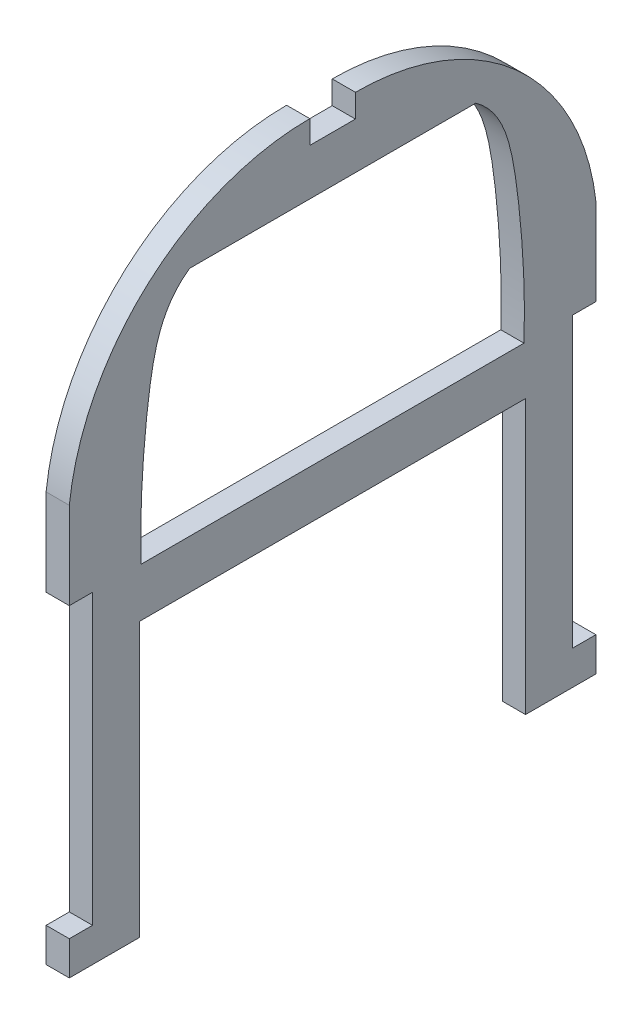
ISO-10303-21;
HEADER;
FILE_DESCRIPTION(('STEP AP214'),'2;1');
FILE_NAME('part.step','',(''),(''),'','','');
FILE_SCHEMA(('AUTOMOTIVE_DESIGN { 1 0 10303 214 1 1 1 1 }'));
ENDSEC;
DATA;
#1=APPLICATION_CONTEXT('core data for automotive mechanical design processes');
#2=APPLICATION_PROTOCOL_DEFINITION('international standard','automotive_design',2000,#1);
#3=PRODUCT_CONTEXT('',#1,'mechanical');
#4=PRODUCT('Part','Part','',(#3));
#5=PRODUCT_RELATED_PRODUCT_CATEGORY('part','',(#4));
#6=PRODUCT_DEFINITION_FORMATION('','',#4);
#7=PRODUCT_DEFINITION_CONTEXT('part definition',#1,'design');
#8=PRODUCT_DEFINITION('design','',#6,#7);
#9=PRODUCT_DEFINITION_SHAPE('','',#8);
#10=(LENGTH_UNIT() NAMED_UNIT(*) SI_UNIT(.MILLI.,.METRE.));
#11=(NAMED_UNIT(*) PLANE_ANGLE_UNIT() SI_UNIT($,.RADIAN.));
#12=(NAMED_UNIT(*) SI_UNIT($,.STERADIAN.) SOLID_ANGLE_UNIT());
#13=UNCERTAINTY_MEASURE_WITH_UNIT(LENGTH_MEASURE(1.E-05),#10,'distance_accuracy_value','');
#14=(GEOMETRIC_REPRESENTATION_CONTEXT(3) GLOBAL_UNCERTAINTY_ASSIGNED_CONTEXT((#13)) GLOBAL_UNIT_ASSIGNED_CONTEXT((#10,
#11,#12)) REPRESENTATION_CONTEXT('',''));
#15=CARTESIAN_POINT('',(0.,0.,0.));
#16=DIRECTION('',(0.,0.,1.));
#17=DIRECTION('',(1.,0.,0.));
#18=AXIS2_PLACEMENT_3D('',#15,#16,#17);
#19=CARTESIAN_POINT('',(3.,30.,18.5));
#20=CARTESIAN_POINT('',(3.,27.6227521418104,21.8999217496941));
#21=CARTESIAN_POINT('',(3.,22.0645423239073,23.3386148930416));
#22=CARTESIAN_POINT('',(3.,11.6888924553406,24.6033177757509));
#23=CARTESIAN_POINT('',(3.,4.97196171850311,24.9290049914649));
#24=CARTESIAN_POINT('',(3.,0.,24.75));
#25=B_SPLINE_CURVE_WITH_KNOTS('',3,(#19,#20,#21,#22,#23,#24),.UNSPECIFIED.,.F.,.F.,(4,1,1,4),
(0.,0.363581561104022,0.525534896752478,1.),.UNSPECIFIED.);
#26=DIRECTION('',(-1.,0.,0.));
#27=VECTOR('',#26,1.);
#28=SURFACE_OF_LINEAR_EXTRUSION('',#25,#27);
#29=CARTESIAN_POINT('',(0.,30.,18.5));
#30=CARTESIAN_POINT('',(0.,27.6227521418104,21.8999217496941));
#31=CARTESIAN_POINT('',(0.,22.0645423239073,23.3386148930416));
#32=CARTESIAN_POINT('',(0.,11.6888924553406,24.6033177757509));
#33=CARTESIAN_POINT('',(0.,4.97196171850311,24.9290049914649));
#34=CARTESIAN_POINT('',(0.,0.,24.75));
#35=B_SPLINE_CURVE_WITH_KNOTS('',3,(#29,#30,#31,#32,#33,#34),.UNSPECIFIED.,.F.,.F.,(4,1,1,4),
(0.,0.363581561104022,0.525534896752478,1.),.UNSPECIFIED.);
#36=CARTESIAN_POINT('',(0.,30.,18.5));
#37=VERTEX_POINT('',#36);
#38=CARTESIAN_POINT('',(0.,0.,24.75));
#39=VERTEX_POINT('',#38);
#40=EDGE_CURVE('E297',#37,#39,#35,.T.);
#41=ORIENTED_EDGE('',*,*,#40,.F.);
#42=DIRECTION('',(-1.,0.,0.));
#43=VECTOR('',#42,1.);
#44=CARTESIAN_POINT('',(3.,30.,18.5));
#45=LINE('',#44,#43);
#46=CARTESIAN_POINT('',(3.,30.,18.5));
#47=VERTEX_POINT('',#46);
#48=EDGE_CURVE('E11',#47,#37,#45,.T.);
#49=ORIENTED_EDGE('',*,*,#48,.F.);
#50=CARTESIAN_POINT('',(3.,0.,24.75));
#51=VERTEX_POINT('',#50);
#52=EDGE_CURVE('E224',#47,#51,#25,.T.);
#53=ORIENTED_EDGE('',*,*,#52,.T.);
#54=DIRECTION('',(-1.,0.,0.));
#55=VECTOR('',#54,1.);
#56=CARTESIAN_POINT('',(3.,0.,24.75));
#57=LINE('',#56,#55);
#58=EDGE_CURVE('E62',#51,#39,#57,.T.);
#59=ORIENTED_EDGE('',*,*,#58,.T.);
#60=EDGE_LOOP('',(#41,#49,#53,#59));
#61=FACE_BOUND('',#60,.T.);
#62=ADVANCED_FACE('F43',(#61),#28,.T.);
#63=CARTESIAN_POINT('',(3.,30.,0.));
#64=DIRECTION('',(0.,1.,0.));
#65=DIRECTION('',(0.,0.,1.));
#66=AXIS2_PLACEMENT_3D('',#63,#64,#65);
#67=PLANE('',#66);
#68=DIRECTION('',(0.,0.,-1.));
#69=VECTOR('',#68,1.);
#70=CARTESIAN_POINT('',(0.,30.,0.));
#71=LINE('',#70,#69);
#72=CARTESIAN_POINT('',(0.,30.,-18.5));
#73=VERTEX_POINT('',#72);
#74=EDGE_CURVE('E229',#37,#73,#71,.T.);
#75=ORIENTED_EDGE('',*,*,#74,.T.);
#76=DIRECTION('',(-1.,0.,0.));
#77=VECTOR('',#76,1.);
#78=CARTESIAN_POINT('',(3.,30.,-18.5));
#79=LINE('',#78,#77);
#80=CARTESIAN_POINT('',(3.,30.,-18.5));
#81=VERTEX_POINT('',#80);
#82=EDGE_CURVE('E53',#81,#73,#79,.T.);
#83=ORIENTED_EDGE('',*,*,#82,.F.);
#84=DIRECTION('',(0.,0.,-1.));
#85=VECTOR('',#84,1.);
#86=CARTESIAN_POINT('',(3.,30.,0.));
#87=LINE('',#86,#85);
#88=EDGE_CURVE('E219',#47,#81,#87,.T.);
#89=ORIENTED_EDGE('',*,*,#88,.F.);
#90=ORIENTED_EDGE('',*,*,#48,.T.);
#91=EDGE_LOOP('',(#75,#83,#89,#90));
#92=FACE_BOUND('',#91,.T.);
#93=ADVANCED_FACE('F227',(#92),#67,.F.);
#94=CARTESIAN_POINT('',(3.,30.,-18.5));
#95=CARTESIAN_POINT('',(3.,27.6227521418104,-21.8999217496941));
#96=CARTESIAN_POINT('',(3.,22.0645423239073,-23.3386148930416));
#97=CARTESIAN_POINT('',(3.,11.6888924553406,-24.6033177757509));
#98=CARTESIAN_POINT('',(3.,4.97196171850311,-24.9290049914649));
#99=CARTESIAN_POINT('',(3.,0.,-24.75));
#100=B_SPLINE_CURVE_WITH_KNOTS('',3,(#94,#95,#96,#97,#98,#99),.UNSPECIFIED.,.F.,.F.,(4,1,1,4),
(0.,0.363581561104022,0.525534896752478,1.),.UNSPECIFIED.);
#101=DIRECTION('',(-1.,0.,0.));
#102=VECTOR('',#101,1.);
#103=SURFACE_OF_LINEAR_EXTRUSION('',#100,#102);
#104=CARTESIAN_POINT('',(0.,30.,-18.5));
#105=CARTESIAN_POINT('',(0.,27.6227521418104,-21.8999217496941));
#106=CARTESIAN_POINT('',(0.,22.0645423239073,-23.3386148930416));
#107=CARTESIAN_POINT('',(0.,11.6888924553406,-24.6033177757509));
#108=CARTESIAN_POINT('',(0.,4.97196171850311,-24.9290049914649));
#109=CARTESIAN_POINT('',(0.,0.,-24.75));
#110=B_SPLINE_CURVE_WITH_KNOTS('',3,(#104,#105,#106,#107,#108,#109),.UNSPECIFIED.,.F.,.F.,(4,1,
1,4),(0.,0.363581561104022,0.525534896752478,1.),.UNSPECIFIED.);
#111=CARTESIAN_POINT('',(0.,0.,-24.75));
#112=VERTEX_POINT('',#111);
#113=EDGE_CURVE('E289',#73,#112,#110,.T.);
#114=ORIENTED_EDGE('',*,*,#113,.T.);
#115=DIRECTION('',(-1.,0.,0.));
#116=VECTOR('',#115,1.);
#117=CARTESIAN_POINT('',(3.,0.,-24.75));
#118=LINE('',#117,#116);
#119=CARTESIAN_POINT('',(3.,0.,-24.75));
#120=VERTEX_POINT('',#119);
#121=EDGE_CURVE('E136',#120,#112,#118,.T.);
#122=ORIENTED_EDGE('',*,*,#121,.F.);
#123=EDGE_CURVE('E211',#81,#120,#100,.T.);
#124=ORIENTED_EDGE('',*,*,#123,.F.);
#125=ORIENTED_EDGE('',*,*,#82,.T.);
#126=EDGE_LOOP('',(#114,#122,#124,#125));
#127=FACE_BOUND('',#126,.T.);
#128=ADVANCED_FACE('F213',(#127),#103,.F.);
#129=CARTESIAN_POINT('',(3.,0.,-31.05));
#130=DIRECTION('',(0.,0.,-1.));
#131=DIRECTION('',(0.,1.,0.));
#132=AXIS2_PLACEMENT_3D('',#129,#130,#131);
#133=PLANE('',#132);
#134=DIRECTION('',(0.,-1.,0.));
#135=VECTOR('',#134,1.);
#136=CARTESIAN_POINT('',(0.,0.,-31.05));
#137=LINE('',#136,#135);
#138=CARTESIAN_POINT('',(0.,0.,-31.05));
#139=VERTEX_POINT('',#138);
#140=CARTESIAN_POINT('',(0.,-37.3,-31.05));
#141=VERTEX_POINT('',#140);
#142=EDGE_CURVE('E353',#139,#141,#137,.T.);
#143=ORIENTED_EDGE('',*,*,#142,.F.);
#144=DIRECTION('',(-1.,0.,0.));
#145=VECTOR('',#144,1.);
#146=CARTESIAN_POINT('',(3.,0.,-31.05));
#147=LINE('',#146,#145);
#148=CARTESIAN_POINT('',(3.,0.,-31.05));
#149=VERTEX_POINT('',#148);
#150=EDGE_CURVE('E47',#149,#139,#147,.T.);
#151=ORIENTED_EDGE('',*,*,#150,.F.);
#152=DIRECTION('',(0.,-1.,0.));
#153=VECTOR('',#152,1.);
#154=CARTESIAN_POINT('',(3.,0.,-31.05));
#155=LINE('',#154,#153);
#156=CARTESIAN_POINT('',(3.,-37.3,-31.05));
#157=VERTEX_POINT('',#156);
#158=EDGE_CURVE('E288',#149,#157,#155,.T.);
#159=ORIENTED_EDGE('',*,*,#158,.T.);
#160=DIRECTION('',(-1.,0.,0.));
#161=VECTOR('',#160,1.);
#162=CARTESIAN_POINT('',(3.,-37.3,-31.05));
#163=LINE('',#162,#161);
#164=EDGE_CURVE('E234',#157,#141,#163,.T.);
#165=ORIENTED_EDGE('',*,*,#164,.T.);
#166=EDGE_LOOP('',(#143,#151,#159,#165));
#167=FACE_BOUND('',#166,.T.);
#168=ADVANCED_FACE('F45',(#167),#133,.T.);
#169=CARTESIAN_POINT('',(3.,0.,0.));
#170=DIRECTION('',(0.,1.,0.));
#171=DIRECTION('',(0.,0.,1.));
#172=AXIS2_PLACEMENT_3D('',#169,#170,#171);
#173=PLANE('',#172);
#174=DIRECTION('',(0.,0.,-1.));
#175=VECTOR('',#174,1.);
#176=CARTESIAN_POINT('',(0.,0.,0.));
#177=LINE('',#176,#175);
#178=CARTESIAN_POINT('',(0.,0.,-34.05));
#179=VERTEX_POINT('',#178);
#180=EDGE_CURVE('E351',#139,#179,#177,.T.);
#181=ORIENTED_EDGE('',*,*,#180,.T.);
#182=DIRECTION('',(-1.,0.,0.));
#183=VECTOR('',#182,1.);
#184=CARTESIAN_POINT('',(3.,0.,-34.05));
#185=LINE('',#184,#183);
#186=CARTESIAN_POINT('',(3.,0.,-34.05));
#187=VERTEX_POINT('',#186);
#188=EDGE_CURVE('E275',#187,#179,#185,.T.);
#189=ORIENTED_EDGE('',*,*,#188,.F.);
#190=DIRECTION('',(0.,0.,-1.));
#191=VECTOR('',#190,1.);
#192=CARTESIAN_POINT('',(3.,0.,0.));
#193=LINE('',#192,#191);
#194=EDGE_CURVE('E427',#149,#187,#193,.T.);
#195=ORIENTED_EDGE('',*,*,#194,.F.);
#196=ORIENTED_EDGE('',*,*,#150,.T.);
#197=EDGE_LOOP('',(#181,#189,#195,#196));
#198=FACE_BOUND('',#197,.T.);
#199=ADVANCED_FACE('F440',(#198),#173,.F.);
#200=CARTESIAN_POINT('',(3.,0.,-34.05));
#201=DIRECTION('',(0.,0.,1.));
#202=DIRECTION('',(1.,0.,0.));
#203=AXIS2_PLACEMENT_3D('',#200,#201,#202);
#204=PLANE('',#203);
#205=DIRECTION('',(0.,1.,0.));
#206=VECTOR('',#205,1.);
#207=CARTESIAN_POINT('',(0.,0.,-34.05));
#208=LINE('',#207,#206);
#209=CARTESIAN_POINT('',(0.,11.245142960023,-34.05));
#210=VERTEX_POINT('',#209);
#211=EDGE_CURVE('E349',#179,#210,#208,.T.);
#212=ORIENTED_EDGE('',*,*,#211,.T.);
#213=DIRECTION('',(-1.,0.,0.));
#214=VECTOR('',#213,1.);
#215=CARTESIAN_POINT('',(3.,11.245142960023,-34.05));
#216=LINE('',#215,#214);
#217=CARTESIAN_POINT('',(3.,11.245142960023,-34.05));
#218=VERTEX_POINT('',#217);
#219=EDGE_CURVE('E274',#218,#210,#216,.T.);
#220=ORIENTED_EDGE('',*,*,#219,.F.);
#221=DIRECTION('',(0.,1.,0.));
#222=VECTOR('',#221,1.);
#223=CARTESIAN_POINT('',(3.,0.,-34.05));
#224=LINE('',#223,#222);
#225=EDGE_CURVE('E425',#187,#218,#224,.T.);
#226=ORIENTED_EDGE('',*,*,#225,.F.);
#227=ORIENTED_EDGE('',*,*,#188,.T.);
#228=EDGE_LOOP('',(#212,#220,#226,#227));
#229=FACE_BOUND('',#228,.T.);
#230=ADVANCED_FACE('F442',(#229),#204,.F.);
#231=CARTESIAN_POINT('',(3.,7.69841399638855,-2.95));
#232=DIRECTION('',(-1.,0.,0.));
#233=DIRECTION('',(0.,0.,1.));
#234=AXIS2_PLACEMENT_3D('',#231,#232,#233);
#235=CYLINDRICAL_SURFACE('',#234,31.3015860036114);
#236=CARTESIAN_POINT('',(0.,7.69841399638855,-2.95));
#237=DIRECTION('',(1.,0.,0.));
#238=DIRECTION('',(0.,0.,-1.));
#239=AXIS2_PLACEMENT_3D('',#236,#237,#238);
#240=CIRCLE('',#239,31.3015860036114);
#241=CARTESIAN_POINT('',(0.,39.,-2.95));
#242=VERTEX_POINT('',#241);
#243=EDGE_CURVE('E346',#242,#210,#240,.F.);
#244=ORIENTED_EDGE('',*,*,#243,.F.);
#245=DIRECTION('',(-1.,0.,0.));
#246=VECTOR('',#245,1.);
#247=CARTESIAN_POINT('',(3.,39.,-2.95));
#248=LINE('',#247,#246);
#249=CARTESIAN_POINT('',(3.,39.,-2.95));
#250=VERTEX_POINT('',#249);
#251=EDGE_CURVE('E272',#250,#242,#248,.T.);
#252=ORIENTED_EDGE('',*,*,#251,.F.);
#253=CARTESIAN_POINT('',(3.,7.69841399638855,-2.95));
#254=DIRECTION('',(1.,0.,0.));
#255=DIRECTION('',(0.,0.,-1.));
#256=AXIS2_PLACEMENT_3D('',#253,#254,#255);
#257=CIRCLE('',#256,31.3015860036114);
#258=EDGE_CURVE('E422',#250,#218,#257,.F.);
#259=ORIENTED_EDGE('',*,*,#258,.T.);
#260=ORIENTED_EDGE('',*,*,#219,.T.);
#261=EDGE_LOOP('',(#244,#252,#259,#260));
#262=FACE_BOUND('',#261,.T.);
#263=ADVANCED_FACE('F544',(#262),#235,.T.);
#264=CARTESIAN_POINT('',(3.,0.,-2.95));
#265=DIRECTION('',(0.,0.,1.));
#266=DIRECTION('',(1.,0.,0.));
#267=AXIS2_PLACEMENT_3D('',#264,#265,#266);
#268=PLANE('',#267);
#269=DIRECTION('',(0.,1.,0.));
#270=VECTOR('',#269,1.);
#271=CARTESIAN_POINT('',(0.,0.,-2.95));
#272=LINE('',#271,#270);
#273=CARTESIAN_POINT('',(0.,36.,-2.95));
#274=VERTEX_POINT('',#273);
#275=EDGE_CURVE('E343',#274,#242,#272,.T.);
#276=ORIENTED_EDGE('',*,*,#275,.F.);
#277=DIRECTION('',(-1.,0.,0.));
#278=VECTOR('',#277,1.);
#279=CARTESIAN_POINT('',(3.,36.,-2.95));
#280=LINE('',#279,#278);
#281=CARTESIAN_POINT('',(3.,36.,-2.95));
#282=VERTEX_POINT('',#281);
#283=EDGE_CURVE('E270',#282,#274,#280,.T.);
#284=ORIENTED_EDGE('',*,*,#283,.F.);
#285=DIRECTION('',(0.,1.,0.));
#286=VECTOR('',#285,1.);
#287=CARTESIAN_POINT('',(3.,0.,-2.95));
#288=LINE('',#287,#286);
#289=EDGE_CURVE('E419',#282,#250,#288,.T.);
#290=ORIENTED_EDGE('',*,*,#289,.T.);
#291=ORIENTED_EDGE('',*,*,#251,.T.);
#292=EDGE_LOOP('',(#276,#284,#290,#291));
#293=FACE_BOUND('',#292,.T.);
#294=ADVANCED_FACE('F449',(#293),#268,.T.);
#295=CARTESIAN_POINT('',(3.,36.,0.));
#296=DIRECTION('',(0.,1.,0.));
#297=DIRECTION('',(0.,0.,1.));
#298=AXIS2_PLACEMENT_3D('',#295,#296,#297);
#299=PLANE('',#298);
#300=DIRECTION('',(0.,0.,-1.));
#301=VECTOR('',#300,1.);
#302=CARTESIAN_POINT('',(0.,36.,0.));
#303=LINE('',#302,#301);
#304=CARTESIAN_POINT('',(0.,36.,2.95));
#305=VERTEX_POINT('',#304);
#306=EDGE_CURVE('E340',#305,#274,#303,.T.);
#307=ORIENTED_EDGE('',*,*,#306,.F.);
#308=DIRECTION('',(-1.,0.,0.));
#309=VECTOR('',#308,1.);
#310=CARTESIAN_POINT('',(3.,36.,2.95));
#311=LINE('',#310,#309);
#312=CARTESIAN_POINT('',(3.,36.,2.95));
#313=VERTEX_POINT('',#312);
#314=EDGE_CURVE('E268',#313,#305,#311,.T.);
#315=ORIENTED_EDGE('',*,*,#314,.F.);
#316=DIRECTION('',(0.,0.,-1.));
#317=VECTOR('',#316,1.);
#318=CARTESIAN_POINT('',(3.,36.,0.));
#319=LINE('',#318,#317);
#320=EDGE_CURVE('E416',#313,#282,#319,.T.);
#321=ORIENTED_EDGE('',*,*,#320,.T.);
#322=ORIENTED_EDGE('',*,*,#283,.T.);
#323=EDGE_LOOP('',(#307,#315,#321,#322));
#324=FACE_BOUND('',#323,.T.);
#325=ADVANCED_FACE('F453',(#324),#299,.T.);
#326=CARTESIAN_POINT('',(3.,0.,2.95000000000001));
#327=DIRECTION('',(0.,0.,1.));
#328=DIRECTION('',(0.,-1.,0.));
#329=AXIS2_PLACEMENT_3D('',#326,#327,#328);
#330=PLANE('',#329);
#331=DIRECTION('',(0.,1.,0.));
#332=VECTOR('',#331,1.);
#333=CARTESIAN_POINT('',(0.,0.,2.95000000000001));
#334=LINE('',#333,#332);
#335=CARTESIAN_POINT('',(0.,39.,2.95));
#336=VERTEX_POINT('',#335);
#337=EDGE_CURVE('E338',#305,#336,#334,.T.);
#338=ORIENTED_EDGE('',*,*,#337,.T.);
#339=DIRECTION('',(-1.,0.,0.));
#340=VECTOR('',#339,1.);
#341=CARTESIAN_POINT('',(3.,39.,2.95));
#342=LINE('',#341,#340);
#343=CARTESIAN_POINT('',(3.,39.,2.95));
#344=VERTEX_POINT('',#343);
#345=EDGE_CURVE('E265',#344,#336,#342,.T.);
#346=ORIENTED_EDGE('',*,*,#345,.F.);
#347=DIRECTION('',(0.,1.,0.));
#348=VECTOR('',#347,1.);
#349=CARTESIAN_POINT('',(3.,0.,2.95000000000001));
#350=LINE('',#349,#348);
#351=EDGE_CURVE('E414',#313,#344,#350,.T.);
#352=ORIENTED_EDGE('',*,*,#351,.F.);
#353=ORIENTED_EDGE('',*,*,#314,.T.);
#354=EDGE_LOOP('',(#338,#346,#352,#353));
#355=FACE_BOUND('',#354,.T.);
#356=ADVANCED_FACE('F460',(#355),#330,.F.);
#357=CARTESIAN_POINT('',(3.,7.69841399638855,2.95));
#358=DIRECTION('',(-1.,0.,0.));
#359=DIRECTION('',(0.,0.,1.));
#360=AXIS2_PLACEMENT_3D('',#357,#358,#359);
#361=CYLINDRICAL_SURFACE('',#360,31.3015860036114);
#362=CARTESIAN_POINT('',(0.,7.69841399638855,2.95));
#363=DIRECTION('',(1.,0.,0.));
#364=DIRECTION('',(0.,0.,-1.));
#365=AXIS2_PLACEMENT_3D('',#362,#363,#364);
#366=CIRCLE('',#365,31.3015860036114);
#367=CARTESIAN_POINT('',(0.,11.245142960023,34.05));
#368=VERTEX_POINT('',#367);
#369=EDGE_CURVE('E335',#336,#368,#366,.T.);
#370=ORIENTED_EDGE('',*,*,#369,.T.);
#371=DIRECTION('',(-1.,0.,0.));
#372=VECTOR('',#371,1.);
#373=CARTESIAN_POINT('',(3.,11.245142960023,34.05));
#374=LINE('',#373,#372);
#375=CARTESIAN_POINT('',(3.,11.245142960023,34.05));
#376=VERTEX_POINT('',#375);
#377=EDGE_CURVE('E263',#376,#368,#374,.T.);
#378=ORIENTED_EDGE('',*,*,#377,.F.);
#379=CARTESIAN_POINT('',(3.,7.69841399638855,2.95));
#380=DIRECTION('',(1.,0.,0.));
#381=DIRECTION('',(0.,0.,-1.));
#382=AXIS2_PLACEMENT_3D('',#379,#380,#381);
#383=CIRCLE('',#382,31.3015860036114);
#384=EDGE_CURVE('E412',#344,#376,#383,.T.);
#385=ORIENTED_EDGE('',*,*,#384,.F.);
#386=ORIENTED_EDGE('',*,*,#345,.T.);
#387=EDGE_LOOP('',(#370,#378,#385,#386));
#388=FACE_BOUND('',#387,.T.);
#389=ADVANCED_FACE('F464',(#388),#361,.T.);
#390=CARTESIAN_POINT('',(3.,0.,34.05));
#391=DIRECTION('',(0.,0.,1.));
#392=DIRECTION('',(1.,0.,0.));
#393=AXIS2_PLACEMENT_3D('',#390,#391,#392);
#394=PLANE('',#393);
#395=DIRECTION('',(0.,1.,0.));
#396=VECTOR('',#395,1.);
#397=CARTESIAN_POINT('',(0.,0.,34.05));
#398=LINE('',#397,#396);
#399=CARTESIAN_POINT('',(0.,0.,34.05));
#400=VERTEX_POINT('',#399);
#401=EDGE_CURVE('E332',#400,#368,#398,.T.);
#402=ORIENTED_EDGE('',*,*,#401,.F.);
#403=DIRECTION('',(-1.,0.,0.));
#404=VECTOR('',#403,1.);
#405=CARTESIAN_POINT('',(3.,0.,34.05));
#406=LINE('',#405,#404);
#407=CARTESIAN_POINT('',(3.,0.,34.05));
#408=VERTEX_POINT('',#407);
#409=EDGE_CURVE('E261',#408,#400,#406,.T.);
#410=ORIENTED_EDGE('',*,*,#409,.F.);
#411=DIRECTION('',(0.,1.,0.));
#412=VECTOR('',#411,1.);
#413=CARTESIAN_POINT('',(3.,0.,34.05));
#414=LINE('',#413,#412);
#415=EDGE_CURVE('E409',#408,#376,#414,.T.);
#416=ORIENTED_EDGE('',*,*,#415,.T.);
#417=ORIENTED_EDGE('',*,*,#377,.T.);
#418=EDGE_LOOP('',(#402,#410,#416,#417));
#419=FACE_BOUND('',#418,.T.);
#420=ADVANCED_FACE('F467',(#419),#394,.T.);
#421=CARTESIAN_POINT('',(3.,0.,0.));
#422=DIRECTION('',(0.,1.,0.));
#423=DIRECTION('',(0.,0.,1.));
#424=AXIS2_PLACEMENT_3D('',#421,#422,#423);
#425=PLANE('',#424);
#426=DIRECTION('',(0.,0.,-1.));
#427=VECTOR('',#426,1.);
#428=CARTESIAN_POINT('',(0.,0.,0.));
#429=LINE('',#428,#427);
#430=CARTESIAN_POINT('',(0.,0.,31.05));
#431=VERTEX_POINT('',#430);
#432=EDGE_CURVE('E330',#400,#431,#429,.T.);
#433=ORIENTED_EDGE('',*,*,#432,.T.);
#434=DIRECTION('',(-1.,0.,0.));
#435=VECTOR('',#434,1.);
#436=CARTESIAN_POINT('',(3.,0.,31.05));
#437=LINE('',#436,#435);
#438=CARTESIAN_POINT('',(3.,0.,31.05));
#439=VERTEX_POINT('',#438);
#440=EDGE_CURVE('E258',#439,#431,#437,.T.);
#441=ORIENTED_EDGE('',*,*,#440,.F.);
#442=DIRECTION('',(0.,0.,-1.));
#443=VECTOR('',#442,1.);
#444=CARTESIAN_POINT('',(3.,0.,0.));
#445=LINE('',#444,#443);
#446=EDGE_CURVE('E407',#408,#439,#445,.T.);
#447=ORIENTED_EDGE('',*,*,#446,.F.);
#448=ORIENTED_EDGE('',*,*,#409,.T.);
#449=EDGE_LOOP('',(#433,#441,#447,#448));
#450=FACE_BOUND('',#449,.T.);
#451=ADVANCED_FACE('F473',(#450),#425,.F.);
#452=CARTESIAN_POINT('',(3.,0.,31.05));
#453=DIRECTION('',(0.,0.,-1.));
#454=DIRECTION('',(0.,1.,0.));
#455=AXIS2_PLACEMENT_3D('',#452,#453,#454);
#456=PLANE('',#455);
#457=DIRECTION('',(0.,-1.,0.));
#458=VECTOR('',#457,1.);
#459=CARTESIAN_POINT('',(0.,0.,31.05));
#460=LINE('',#459,#458);
#461=CARTESIAN_POINT('',(0.,-37.3,31.05));
#462=VERTEX_POINT('',#461);
#463=EDGE_CURVE('E328',#431,#462,#460,.T.);
#464=ORIENTED_EDGE('',*,*,#463,.T.);
#465=DIRECTION('',(-1.,0.,0.));
#466=VECTOR('',#465,1.);
#467=CARTESIAN_POINT('',(3.,-37.3,31.05));
#468=LINE('',#467,#466);
#469=CARTESIAN_POINT('',(3.,-37.3,31.05));
#470=VERTEX_POINT('',#469);
#471=EDGE_CURVE('E255',#470,#462,#468,.T.);
#472=ORIENTED_EDGE('',*,*,#471,.F.);
#473=DIRECTION('',(0.,-1.,0.));
#474=VECTOR('',#473,1.);
#475=CARTESIAN_POINT('',(3.,0.,31.05));
#476=LINE('',#475,#474);
#477=EDGE_CURVE('E405',#439,#470,#476,.T.);
#478=ORIENTED_EDGE('',*,*,#477,.F.);
#479=ORIENTED_EDGE('',*,*,#440,.T.);
#480=EDGE_LOOP('',(#464,#472,#478,#479));
#481=FACE_BOUND('',#480,.T.);
#482=ADVANCED_FACE('F477',(#481),#456,.F.);
#483=CARTESIAN_POINT('',(3.,-37.3,0.));
#484=DIRECTION('',(0.,-1.,0.));
#485=DIRECTION('',(0.,0.,-1.));
#486=AXIS2_PLACEMENT_3D('',#483,#484,#485);
#487=PLANE('',#486);
#488=DIRECTION('',(0.,0.,1.));
#489=VECTOR('',#488,1.);
#490=CARTESIAN_POINT('',(0.,-37.3,0.));
#491=LINE('',#490,#489);
#492=CARTESIAN_POINT('',(0.,-37.3,34.05));
#493=VERTEX_POINT('',#492);
#494=EDGE_CURVE('E326',#462,#493,#491,.T.);
#495=ORIENTED_EDGE('',*,*,#494,.T.);
#496=DIRECTION('',(-1.,0.,0.));
#497=VECTOR('',#496,1.);
#498=CARTESIAN_POINT('',(3.,-37.3,34.05));
#499=LINE('',#498,#497);
#500=CARTESIAN_POINT('',(3.,-37.3,34.05));
#501=VERTEX_POINT('',#500);
#502=EDGE_CURVE('E252',#501,#493,#499,.T.);
#503=ORIENTED_EDGE('',*,*,#502,.F.);
#504=DIRECTION('',(0.,0.,1.));
#505=VECTOR('',#504,1.);
#506=CARTESIAN_POINT('',(3.,-37.3,0.));
#507=LINE('',#506,#505);
#508=EDGE_CURVE('E403',#470,#501,#507,.T.);
#509=ORIENTED_EDGE('',*,*,#508,.F.);
#510=ORIENTED_EDGE('',*,*,#471,.T.);
#511=EDGE_LOOP('',(#495,#503,#509,#510));
#512=FACE_BOUND('',#511,.T.);
#513=ADVANCED_FACE('F482',(#512),#487,.F.);
#514=CARTESIAN_POINT('',(3.,0.,34.05));
#515=DIRECTION('',(0.,0.,-1.));
#516=DIRECTION('',(-1.,0.,0.));
#517=AXIS2_PLACEMENT_3D('',#514,#515,#516);
#518=PLANE('',#517);
#519=DIRECTION('',(0.,-1.,0.));
#520=VECTOR('',#519,1.);
#521=CARTESIAN_POINT('',(0.,0.,34.05));
#522=LINE('',#521,#520);
#523=CARTESIAN_POINT('',(0.,-41.7,34.05));
#524=VERTEX_POINT('',#523);
#525=EDGE_CURVE('E324',#493,#524,#522,.T.);
#526=ORIENTED_EDGE('',*,*,#525,.T.);
#527=DIRECTION('',(-1.,0.,0.));
#528=VECTOR('',#527,1.);
#529=CARTESIAN_POINT('',(3.,-41.7,34.05));
#530=LINE('',#529,#528);
#531=CARTESIAN_POINT('',(3.,-41.7,34.05));
#532=VERTEX_POINT('',#531);
#533=EDGE_CURVE('E249',#532,#524,#530,.T.);
#534=ORIENTED_EDGE('',*,*,#533,.F.);
#535=DIRECTION('',(0.,-1.,0.));
#536=VECTOR('',#535,1.);
#537=CARTESIAN_POINT('',(3.,0.,34.05));
#538=LINE('',#537,#536);
#539=EDGE_CURVE('E401',#501,#532,#538,.T.);
#540=ORIENTED_EDGE('',*,*,#539,.F.);
#541=ORIENTED_EDGE('',*,*,#502,.T.);
#542=EDGE_LOOP('',(#526,#534,#540,#541));
#543=FACE_BOUND('',#542,.T.);
#544=ADVANCED_FACE('F488',(#543),#518,.F.);
#545=CARTESIAN_POINT('',(3.,-41.7,0.));
#546=DIRECTION('',(0.,1.,0.));
#547=DIRECTION('',(0.,0.,1.));
#548=AXIS2_PLACEMENT_3D('',#545,#546,#547);
#549=PLANE('',#548);
#550=DIRECTION('',(0.,0.,-1.));
#551=VECTOR('',#550,1.);
#552=CARTESIAN_POINT('',(0.,-41.7,0.));
#553=LINE('',#552,#551);
#554=CARTESIAN_POINT('',(0.,-41.7,24.95));
#555=VERTEX_POINT('',#554);
#556=EDGE_CURVE('E322',#524,#555,#553,.T.);
#557=ORIENTED_EDGE('',*,*,#556,.T.);
#558=DIRECTION('',(-1.,0.,0.));
#559=VECTOR('',#558,1.);
#560=CARTESIAN_POINT('',(3.,-41.7,24.95));
#561=LINE('',#560,#559);
#562=CARTESIAN_POINT('',(3.,-41.7,24.95));
#563=VERTEX_POINT('',#562);
#564=EDGE_CURVE('E246',#563,#555,#561,.T.);
#565=ORIENTED_EDGE('',*,*,#564,.F.);
#566=DIRECTION('',(0.,0.,-1.));
#567=VECTOR('',#566,1.);
#568=CARTESIAN_POINT('',(3.,-41.7,0.));
#569=LINE('',#568,#567);
#570=EDGE_CURVE('E399',#532,#563,#569,.T.);
#571=ORIENTED_EDGE('',*,*,#570,.F.);
#572=ORIENTED_EDGE('',*,*,#533,.T.);
#573=EDGE_LOOP('',(#557,#565,#571,#572));
#574=FACE_BOUND('',#573,.T.);
#575=ADVANCED_FACE('F492',(#574),#549,.F.);
#576=CARTESIAN_POINT('',(3.,0.,24.95));
#577=DIRECTION('',(0.,0.,1.));
#578=DIRECTION('',(0.,-1.,0.));
#579=AXIS2_PLACEMENT_3D('',#576,#577,#578);
#580=PLANE('',#579);
#581=DIRECTION('',(0.,1.,0.));
#582=VECTOR('',#581,1.);
#583=CARTESIAN_POINT('',(0.,0.,24.95));
#584=LINE('',#583,#582);
#585=CARTESIAN_POINT('',(0.,-6.3,24.95));
#586=VERTEX_POINT('',#585);
#587=EDGE_CURVE('E319',#555,#586,#584,.T.);
#588=ORIENTED_EDGE('',*,*,#587,.T.);
#589=DIRECTION('',(-1.,0.,0.));
#590=VECTOR('',#589,1.);
#591=CARTESIAN_POINT('',(3.,-6.3,24.95));
#592=LINE('',#591,#590);
#593=CARTESIAN_POINT('',(3.,-6.3,24.95));
#594=VERTEX_POINT('',#593);
#595=EDGE_CURVE('E244',#594,#586,#592,.T.);
#596=ORIENTED_EDGE('',*,*,#595,.F.);
#597=DIRECTION('',(0.,1.,0.));
#598=VECTOR('',#597,1.);
#599=CARTESIAN_POINT('',(3.,0.,24.95));
#600=LINE('',#599,#598);
#601=EDGE_CURVE('E397',#563,#594,#600,.T.);
#602=ORIENTED_EDGE('',*,*,#601,.F.);
#603=ORIENTED_EDGE('',*,*,#564,.T.);
#604=EDGE_LOOP('',(#588,#596,#602,#603));
#605=FACE_BOUND('',#604,.T.);
#606=ADVANCED_FACE('F497',(#605),#580,.F.);
#607=CARTESIAN_POINT('',(3.,-6.3,0.));
#608=DIRECTION('',(0.,-1.,0.));
#609=DIRECTION('',(0.,0.,-1.));
#610=AXIS2_PLACEMENT_3D('',#607,#608,#609);
#611=PLANE('',#610);
#612=DIRECTION('',(0.,0.,1.));
#613=VECTOR('',#612,1.);
#614=CARTESIAN_POINT('',(0.,-6.3,0.));
#615=LINE('',#614,#613);
#616=CARTESIAN_POINT('',(0.,-6.3,-24.95));
#617=VERTEX_POINT('',#616);
#618=EDGE_CURVE('E316',#617,#586,#615,.T.);
#619=ORIENTED_EDGE('',*,*,#618,.F.);
#620=DIRECTION('',(-1.,0.,0.));
#621=VECTOR('',#620,1.);
#622=CARTESIAN_POINT('',(3.,-6.3,-24.95));
#623=LINE('',#622,#621);
#624=CARTESIAN_POINT('',(3.,-6.3,-24.95));
#625=VERTEX_POINT('',#624);
#626=EDGE_CURVE('E242',#625,#617,#623,.T.);
#627=ORIENTED_EDGE('',*,*,#626,.F.);
#628=DIRECTION('',(0.,0.,1.));
#629=VECTOR('',#628,1.);
#630=CARTESIAN_POINT('',(3.,-6.3,0.));
#631=LINE('',#630,#629);
#632=EDGE_CURVE('E394',#625,#594,#631,.T.);
#633=ORIENTED_EDGE('',*,*,#632,.T.);
#634=ORIENTED_EDGE('',*,*,#595,.T.);
#635=EDGE_LOOP('',(#619,#627,#633,#634));
#636=FACE_BOUND('',#635,.T.);
#637=ADVANCED_FACE('F519',(#636),#611,.T.);
#638=CARTESIAN_POINT('',(3.,0.,-24.95));
#639=DIRECTION('',(0.,0.,1.));
#640=DIRECTION('',(0.,-1.,0.));
#641=AXIS2_PLACEMENT_3D('',#638,#639,#640);
#642=PLANE('',#641);
#643=DIRECTION('',(0.,1.,0.));
#644=VECTOR('',#643,1.);
#645=CARTESIAN_POINT('',(0.,0.,-24.95));
#646=LINE('',#645,#644);
#647=CARTESIAN_POINT('',(0.,-41.7,-24.95));
#648=VERTEX_POINT('',#647);
#649=EDGE_CURVE('E313',#648,#617,#646,.T.);
#650=ORIENTED_EDGE('',*,*,#649,.F.);
#651=DIRECTION('',(-1.,0.,0.));
#652=VECTOR('',#651,1.);
#653=CARTESIAN_POINT('',(3.,-41.7,-24.95));
#654=LINE('',#653,#652);
#655=CARTESIAN_POINT('',(3.,-41.7,-24.95));
#656=VERTEX_POINT('',#655);
#657=EDGE_CURVE('E240',#656,#648,#654,.T.);
#658=ORIENTED_EDGE('',*,*,#657,.F.);
#659=DIRECTION('',(0.,1.,0.));
#660=VECTOR('',#659,1.);
#661=CARTESIAN_POINT('',(3.,0.,-24.95));
#662=LINE('',#661,#660);
#663=EDGE_CURVE('E391',#656,#625,#662,.T.);
#664=ORIENTED_EDGE('',*,*,#663,.T.);
#665=ORIENTED_EDGE('',*,*,#626,.T.);
#666=EDGE_LOOP('',(#650,#658,#664,#665));
#667=FACE_BOUND('',#666,.T.);
#668=ADVANCED_FACE('F503',(#667),#642,.T.);
#669=CARTESIAN_POINT('',(3.,-41.7,0.));
#670=DIRECTION('',(0.,-1.,0.));
#671=DIRECTION('',(0.,0.,-1.));
#672=AXIS2_PLACEMENT_3D('',#669,#670,#671);
#673=PLANE('',#672);
#674=DIRECTION('',(0.,0.,1.));
#675=VECTOR('',#674,1.);
#676=CARTESIAN_POINT('',(0.,-41.7,0.));
#677=LINE('',#676,#675);
#678=CARTESIAN_POINT('',(0.,-41.7,-34.05));
#679=VERTEX_POINT('',#678);
#680=EDGE_CURVE('E310',#679,#648,#677,.T.);
#681=ORIENTED_EDGE('',*,*,#680,.F.);
#682=DIRECTION('',(-1.,0.,0.));
#683=VECTOR('',#682,1.);
#684=CARTESIAN_POINT('',(3.,-41.7,-34.05));
#685=LINE('',#684,#683);
#686=CARTESIAN_POINT('',(3.,-41.7,-34.05));
#687=VERTEX_POINT('',#686);
#688=EDGE_CURVE('E238',#687,#679,#685,.T.);
#689=ORIENTED_EDGE('',*,*,#688,.F.);
#690=DIRECTION('',(0.,0.,1.));
#691=VECTOR('',#690,1.);
#692=CARTESIAN_POINT('',(3.,-41.7,0.));
#693=LINE('',#692,#691);
#694=EDGE_CURVE('E388',#687,#656,#693,.T.);
#695=ORIENTED_EDGE('',*,*,#694,.T.);
#696=ORIENTED_EDGE('',*,*,#657,.T.);
#697=EDGE_LOOP('',(#681,#689,#695,#696));
#698=FACE_BOUND('',#697,.T.);
#699=ADVANCED_FACE('F507',(#698),#673,.T.);
#700=CARTESIAN_POINT('',(3.,0.,-34.05));
#701=DIRECTION('',(0.,0.,-1.));
#702=DIRECTION('',(-1.,0.,0.));
#703=AXIS2_PLACEMENT_3D('',#700,#701,#702);
#704=PLANE('',#703);
#705=DIRECTION('',(0.,-1.,0.));
#706=VECTOR('',#705,1.);
#707=CARTESIAN_POINT('',(0.,0.,-34.05));
#708=LINE('',#707,#706);
#709=CARTESIAN_POINT('',(0.,-37.3,-34.05));
#710=VERTEX_POINT('',#709);
#711=EDGE_CURVE('E307',#710,#679,#708,.T.);
#712=ORIENTED_EDGE('',*,*,#711,.F.);
#713=DIRECTION('',(-1.,0.,0.));
#714=VECTOR('',#713,1.);
#715=CARTESIAN_POINT('',(3.,-37.3,-34.05));
#716=LINE('',#715,#714);
#717=CARTESIAN_POINT('',(3.,-37.3,-34.05));
#718=VERTEX_POINT('',#717);
#719=EDGE_CURVE('E236',#718,#710,#716,.T.);
#720=ORIENTED_EDGE('',*,*,#719,.F.);
#721=DIRECTION('',(0.,-1.,0.));
#722=VECTOR('',#721,1.);
#723=CARTESIAN_POINT('',(3.,0.,-34.05));
#724=LINE('',#723,#722);
#725=EDGE_CURVE('E385',#718,#687,#724,.T.);
#726=ORIENTED_EDGE('',*,*,#725,.T.);
#727=ORIENTED_EDGE('',*,*,#688,.T.);
#728=EDGE_LOOP('',(#712,#720,#726,#727));
#729=FACE_BOUND('',#728,.T.);
#730=ADVANCED_FACE('F509',(#729),#704,.T.);
#731=CARTESIAN_POINT('',(3.,-37.3,0.));
#732=DIRECTION('',(0.,1.,0.));
#733=DIRECTION('',(0.,0.,1.));
#734=AXIS2_PLACEMENT_3D('',#731,#732,#733);
#735=PLANE('',#734);
#736=DIRECTION('',(0.,0.,-1.));
#737=VECTOR('',#736,1.);
#738=CARTESIAN_POINT('',(0.,-37.3,0.));
#739=LINE('',#738,#737);
#740=EDGE_CURVE('E301',#141,#710,#739,.T.);
#741=ORIENTED_EDGE('',*,*,#740,.F.);
#742=ORIENTED_EDGE('',*,*,#164,.F.);
#743=DIRECTION('',(0.,0.,-1.));
#744=VECTOR('',#743,1.);
#745=CARTESIAN_POINT('',(3.,-37.3,0.));
#746=LINE('',#745,#744);
#747=EDGE_CURVE('E379',#157,#718,#746,.T.);
#748=ORIENTED_EDGE('',*,*,#747,.T.);
#749=ORIENTED_EDGE('',*,*,#719,.T.);
#750=EDGE_LOOP('',(#741,#742,#748,#749));
#751=FACE_BOUND('',#750,.T.);
#752=ADVANCED_FACE('F373',(#751),#735,.T.);
#753=CARTESIAN_POINT('',(3.,0.,0.));
#754=DIRECTION('',(0.,1.,0.));
#755=DIRECTION('',(0.,0.,1.));
#756=AXIS2_PLACEMENT_3D('',#753,#754,#755);
#757=PLANE('',#756);
#758=DIRECTION('',(0.,0.,-1.));
#759=VECTOR('',#758,1.);
#760=CARTESIAN_POINT('',(0.,0.,0.));
#761=LINE('',#760,#759);
#762=EDGE_CURVE('E285',#39,#112,#761,.T.);
#763=ORIENTED_EDGE('',*,*,#762,.F.);
#764=ORIENTED_EDGE('',*,*,#58,.F.);
#765=DIRECTION('',(0.,0.,-1.));
#766=VECTOR('',#765,1.);
#767=CARTESIAN_POINT('',(3.,0.,0.));
#768=LINE('',#767,#766);
#769=EDGE_CURVE('E218',#51,#120,#768,.T.);
#770=ORIENTED_EDGE('',*,*,#769,.T.);
#771=ORIENTED_EDGE('',*,*,#121,.T.);
#772=EDGE_LOOP('',(#763,#764,#770,#771));
#773=FACE_BOUND('',#772,.T.);
#774=ADVANCED_FACE('F367',(#773),#757,.T.);
#775=CARTESIAN_POINT('',(3.,0.,0.));
#776=DIRECTION('',(1.,0.,0.));
#777=DIRECTION('',(0.,0.,-1.));
#778=AXIS2_PLACEMENT_3D('',#775,#776,#777);
#779=PLANE('',#778);
#780=ORIENTED_EDGE('',*,*,#158,.F.);
#781=ORIENTED_EDGE('',*,*,#194,.T.);
#782=ORIENTED_EDGE('',*,*,#225,.T.);
#783=ORIENTED_EDGE('',*,*,#258,.F.);
#784=ORIENTED_EDGE('',*,*,#289,.F.);
#785=ORIENTED_EDGE('',*,*,#320,.F.);
#786=ORIENTED_EDGE('',*,*,#351,.T.);
#787=ORIENTED_EDGE('',*,*,#384,.T.);
#788=ORIENTED_EDGE('',*,*,#415,.F.);
#789=ORIENTED_EDGE('',*,*,#446,.T.);
#790=ORIENTED_EDGE('',*,*,#477,.T.);
#791=ORIENTED_EDGE('',*,*,#508,.T.);
#792=ORIENTED_EDGE('',*,*,#539,.T.);
#793=ORIENTED_EDGE('',*,*,#570,.T.);
#794=ORIENTED_EDGE('',*,*,#601,.T.);
#795=ORIENTED_EDGE('',*,*,#632,.F.);
#796=ORIENTED_EDGE('',*,*,#663,.F.);
#797=ORIENTED_EDGE('',*,*,#694,.F.);
#798=ORIENTED_EDGE('',*,*,#725,.F.);
#799=ORIENTED_EDGE('',*,*,#747,.F.);
#800=EDGE_LOOP('',(#780,#781,#782,#783,#784,#785,#786,#787,#788,#789,#790,#791,#792,#793,#794,
#795,#796,#797,#798,#799));
#801=FACE_BOUND('',#800,.T.);
#802=ORIENTED_EDGE('',*,*,#52,.F.);
#803=ORIENTED_EDGE('',*,*,#88,.T.);
#804=ORIENTED_EDGE('',*,*,#123,.T.);
#805=ORIENTED_EDGE('',*,*,#769,.F.);
#806=EDGE_LOOP('',(#802,#803,#804,#805));
#807=FACE_BOUND('',#806,.T.);
#808=ADVANCED_FACE('F223',(#801,#807),#779,.T.);
#809=CARTESIAN_POINT('',(0.,0.,0.));
#810=DIRECTION('',(1.,0.,0.));
#811=DIRECTION('',(0.,0.,-1.));
#812=AXIS2_PLACEMENT_3D('',#809,#810,#811);
#813=PLANE('',#812);
#814=ORIENTED_EDGE('',*,*,#142,.T.);
#815=ORIENTED_EDGE('',*,*,#740,.T.);
#816=ORIENTED_EDGE('',*,*,#711,.T.);
#817=ORIENTED_EDGE('',*,*,#680,.T.);
#818=ORIENTED_EDGE('',*,*,#649,.T.);
#819=ORIENTED_EDGE('',*,*,#618,.T.);
#820=ORIENTED_EDGE('',*,*,#587,.F.);
#821=ORIENTED_EDGE('',*,*,#556,.F.);
#822=ORIENTED_EDGE('',*,*,#525,.F.);
#823=ORIENTED_EDGE('',*,*,#494,.F.);
#824=ORIENTED_EDGE('',*,*,#463,.F.);
#825=ORIENTED_EDGE('',*,*,#432,.F.);
#826=ORIENTED_EDGE('',*,*,#401,.T.);
#827=ORIENTED_EDGE('',*,*,#369,.F.);
#828=ORIENTED_EDGE('',*,*,#337,.F.);
#829=ORIENTED_EDGE('',*,*,#306,.T.);
#830=ORIENTED_EDGE('',*,*,#275,.T.);
#831=ORIENTED_EDGE('',*,*,#243,.T.);
#832=ORIENTED_EDGE('',*,*,#211,.F.);
#833=ORIENTED_EDGE('',*,*,#180,.F.);
#834=EDGE_LOOP('',(#814,#815,#816,#817,#818,#819,#820,#821,#822,#823,#824,#825,#826,#827,#828,
#829,#830,#831,#832,#833));
#835=FACE_BOUND('',#834,.T.);
#836=ORIENTED_EDGE('',*,*,#40,.T.);
#837=ORIENTED_EDGE('',*,*,#762,.T.);
#838=ORIENTED_EDGE('',*,*,#113,.F.);
#839=ORIENTED_EDGE('',*,*,#74,.F.);
#840=EDGE_LOOP('',(#836,#837,#838,#839));
#841=FACE_BOUND('',#840,.T.);
#842=ADVANCED_FACE('F438',(#835,#841),#813,.F.);
#843=CLOSED_SHELL('',(#62,#93,#128,#168,#199,#230,#263,#294,#325,#356,#389,#420,#451,#482,#513,
#544,#575,#606,#637,#668,#699,#730,#752,#774,#808,#842));
#844=MANIFOLD_SOLID_BREP('B2',#843);
#845=ADVANCED_BREP_SHAPE_REPRESENTATION('',(#18,#844),#14);
#846=SHAPE_DEFINITION_REPRESENTATION(#9,#845);
ENDSEC;
END-ISO-10303-21;
